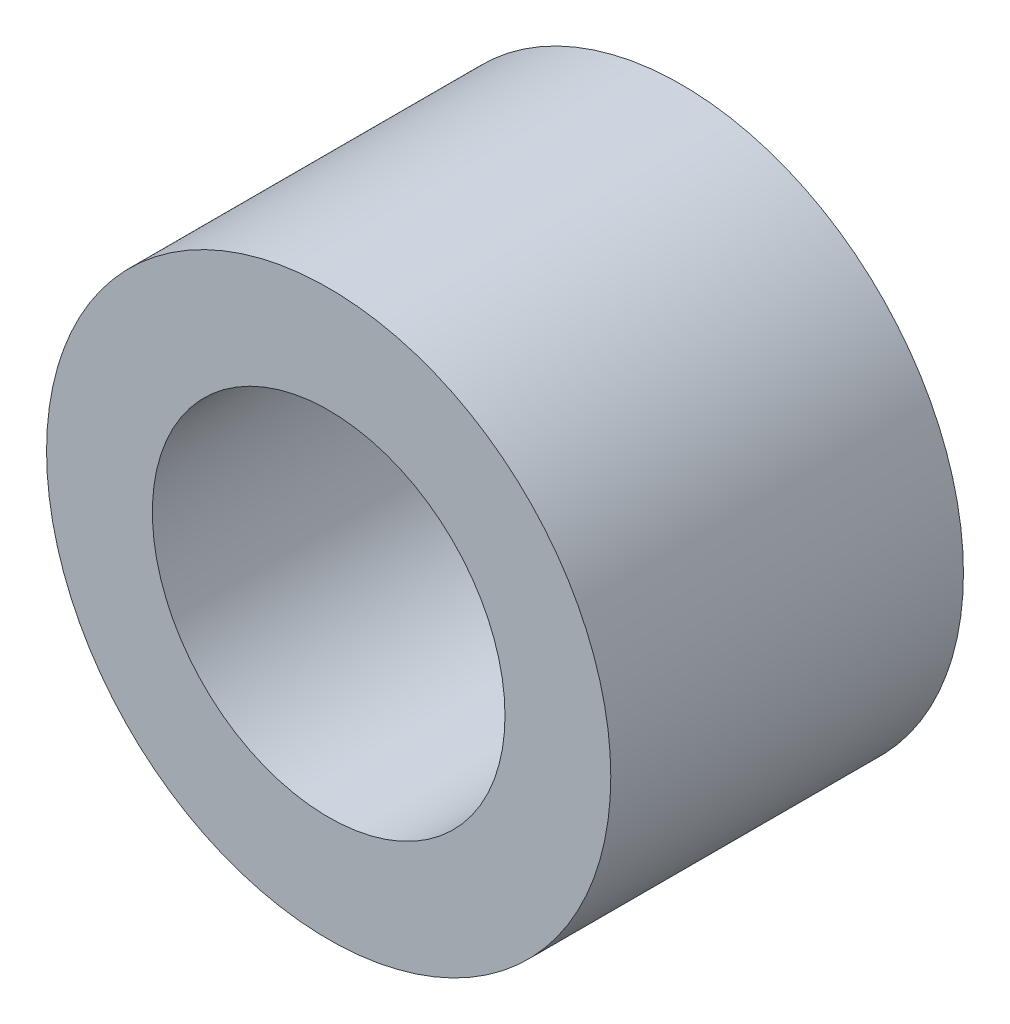
ISO-10303-21;
HEADER;
FILE_DESCRIPTION(('STEP AP214'),'2;1');
FILE_NAME('part.step','',(''),(''),'','','');
FILE_SCHEMA(('AUTOMOTIVE_DESIGN { 1 0 10303 214 1 1 1 1 }'));
ENDSEC;
DATA;
#1=APPLICATION_CONTEXT('core data for automotive mechanical design processes');
#2=APPLICATION_PROTOCOL_DEFINITION('international standard','automotive_design',2000,#1);
#3=PRODUCT_CONTEXT('',#1,'mechanical');
#4=PRODUCT('Part','Part','',(#3));
#5=PRODUCT_RELATED_PRODUCT_CATEGORY('part','',(#4));
#6=PRODUCT_DEFINITION_FORMATION('','',#4);
#7=PRODUCT_DEFINITION_CONTEXT('part definition',#1,'design');
#8=PRODUCT_DEFINITION('design','',#6,#7);
#9=PRODUCT_DEFINITION_SHAPE('','',#8);
#10=(LENGTH_UNIT() NAMED_UNIT(*) SI_UNIT(.MILLI.,.METRE.));
#11=(NAMED_UNIT(*) PLANE_ANGLE_UNIT() SI_UNIT($,.RADIAN.));
#12=(NAMED_UNIT(*) SI_UNIT($,.STERADIAN.) SOLID_ANGLE_UNIT());
#13=UNCERTAINTY_MEASURE_WITH_UNIT(LENGTH_MEASURE(1.E-05),#10,'distance_accuracy_value','');
#14=(GEOMETRIC_REPRESENTATION_CONTEXT(3) GLOBAL_UNCERTAINTY_ASSIGNED_CONTEXT((#13)) GLOBAL_UNIT_ASSIGNED_CONTEXT((#10,
#11,#12)) REPRESENTATION_CONTEXT('',''));
#15=CARTESIAN_POINT('',(0.,0.,0.));
#16=DIRECTION('',(0.,0.,1.));
#17=DIRECTION('',(1.,0.,0.));
#18=AXIS2_PLACEMENT_3D('',#15,#16,#17);
#19=CARTESIAN_POINT('',(0.,0.,5.));
#20=DIRECTION('',(0.,0.,-1.));
#21=DIRECTION('',(-1.,0.,0.));
#22=AXIS2_PLACEMENT_3D('',#19,#20,#21);
#23=CYLINDRICAL_SURFACE('',#22,4.);
#24=CARTESIAN_POINT('',(0.,0.,5.));
#25=DIRECTION('',(0.,0.,1.));
#26=DIRECTION('',(1.,0.,0.));
#27=AXIS2_PLACEMENT_3D('',#24,#25,#26);
#28=CIRCLE('',#27,4.);
#29=CARTESIAN_POINT('',(4.,0.,5.));
#30=VERTEX_POINT('',#29);
#31=EDGE_CURVE('E10',#30,#30,#28,.T.);
#32=ORIENTED_EDGE('',*,*,#31,.F.);
#33=EDGE_LOOP('',(#32));
#34=FACE_BOUND('',#33,.T.);
#35=CARTESIAN_POINT('',(0.,0.,0.));
#36=DIRECTION('',(0.,0.,1.));
#37=DIRECTION('',(1.,0.,0.));
#38=AXIS2_PLACEMENT_3D('',#35,#36,#37);
#39=CIRCLE('',#38,4.);
#40=CARTESIAN_POINT('',(4.,0.,0.));
#41=VERTEX_POINT('',#40);
#42=EDGE_CURVE('E33',#41,#41,#39,.T.);
#43=ORIENTED_EDGE('',*,*,#42,.T.);
#44=EDGE_LOOP('',(#43));
#45=FACE_BOUND('',#44,.T.);
#46=ADVANCED_FACE('F30',(#34,#45),#23,.T.);
#47=CARTESIAN_POINT('',(0.,0.,5.));
#48=DIRECTION('',(0.,0.,1.));
#49=DIRECTION('',(1.,0.,0.));
#50=AXIS2_PLACEMENT_3D('',#47,#48,#49);
#51=PLANE('',#50);
#52=CARTESIAN_POINT('',(0.,0.,5.));
#53=DIRECTION('',(0.,0.,1.));
#54=DIRECTION('',(1.,0.,0.));
#55=AXIS2_PLACEMENT_3D('',#52,#53,#54);
#56=CIRCLE('',#55,2.5);
#57=CARTESIAN_POINT('',(2.5,0.,5.));
#58=VERTEX_POINT('',#57);
#59=EDGE_CURVE('E42',#58,#58,#56,.T.);
#60=ORIENTED_EDGE('',*,*,#59,.F.);
#61=EDGE_LOOP('',(#60));
#62=FACE_BOUND('',#61,.T.);
#63=ORIENTED_EDGE('',*,*,#31,.T.);
#64=EDGE_LOOP('',(#63));
#65=FACE_BOUND('',#64,.T.);
#66=ADVANCED_FACE('F57',(#62,#65),#51,.T.);
#67=CARTESIAN_POINT('',(0.,0.,0.));
#68=DIRECTION('',(0.,0.,1.));
#69=DIRECTION('',(1.,0.,0.));
#70=AXIS2_PLACEMENT_3D('',#67,#68,#69);
#71=PLANE('',#70);
#72=CARTESIAN_POINT('',(0.,0.,0.));
#73=DIRECTION('',(0.,0.,1.));
#74=DIRECTION('',(1.,0.,0.));
#75=AXIS2_PLACEMENT_3D('',#72,#73,#74);
#76=CIRCLE('',#75,2.5);
#77=CARTESIAN_POINT('',(2.5,0.,0.));
#78=VERTEX_POINT('',#77);
#79=EDGE_CURVE('E40',#78,#78,#76,.T.);
#80=ORIENTED_EDGE('',*,*,#79,.T.);
#81=EDGE_LOOP('',(#80));
#82=FACE_BOUND('',#81,.T.);
#83=ORIENTED_EDGE('',*,*,#42,.F.);
#84=EDGE_LOOP('',(#83));
#85=FACE_BOUND('',#84,.T.);
#86=ADVANCED_FACE('F48',(#82,#85),#71,.F.);
#87=CARTESIAN_POINT('',(0.,0.,0.));
#88=DIRECTION('',(0.,0.,1.));
#89=DIRECTION('',(1.,0.,0.));
#90=AXIS2_PLACEMENT_3D('',#87,#88,#89);
#91=CYLINDRICAL_SURFACE('',#90,2.5);
#92=ORIENTED_EDGE('',*,*,#79,.F.);
#93=EDGE_LOOP('',(#92));
#94=FACE_BOUND('',#93,.T.);
#95=ORIENTED_EDGE('',*,*,#59,.T.);
#96=EDGE_LOOP('',(#95));
#97=FACE_BOUND('',#96,.T.);
#98=ADVANCED_FACE('F51',(#94,#97),#91,.F.);
#99=CLOSED_SHELL('',(#46,#66,#86,#98));
#100=MANIFOLD_SOLID_BREP('B2',#99);
#101=ADVANCED_BREP_SHAPE_REPRESENTATION('',(#18,#100),#14);
#102=SHAPE_DEFINITION_REPRESENTATION(#9,#101);
ENDSEC;
END-ISO-10303-21;
